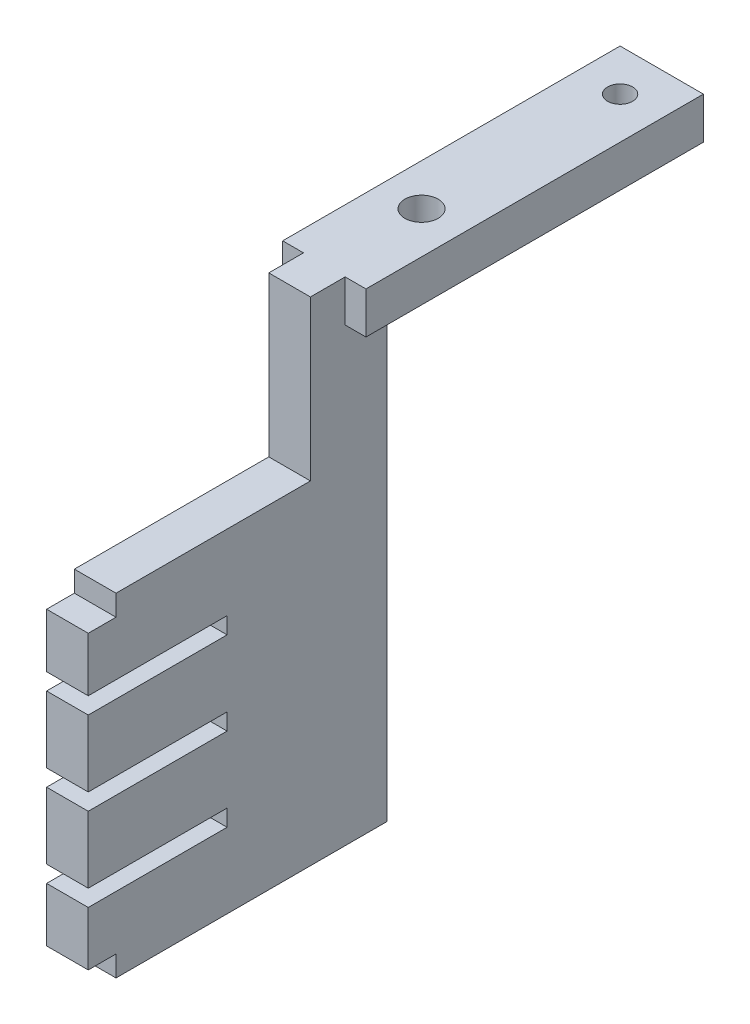
ISO-10303-21;
HEADER;
FILE_DESCRIPTION(('STEP AP214'),'2;1');
FILE_NAME('part.step','',(''),(''),'','','');
FILE_SCHEMA(('AUTOMOTIVE_DESIGN { 1 0 10303 214 1 1 1 1 }'));
ENDSEC;
DATA;
#1=APPLICATION_CONTEXT('core data for automotive mechanical design processes');
#2=APPLICATION_PROTOCOL_DEFINITION('international standard','automotive_design',2000,#1);
#3=PRODUCT_CONTEXT('',#1,'mechanical');
#4=PRODUCT('Part','Part','',(#3));
#5=PRODUCT_RELATED_PRODUCT_CATEGORY('part','',(#4));
#6=PRODUCT_DEFINITION_FORMATION('','',#4);
#7=PRODUCT_DEFINITION_CONTEXT('part definition',#1,'design');
#8=PRODUCT_DEFINITION('design','',#6,#7);
#9=PRODUCT_DEFINITION_SHAPE('','',#8);
#10=(LENGTH_UNIT() NAMED_UNIT(*) SI_UNIT(.MILLI.,.METRE.));
#11=(NAMED_UNIT(*) PLANE_ANGLE_UNIT() SI_UNIT($,.RADIAN.));
#12=(NAMED_UNIT(*) SI_UNIT($,.STERADIAN.) SOLID_ANGLE_UNIT());
#13=UNCERTAINTY_MEASURE_WITH_UNIT(LENGTH_MEASURE(1.E-05),#10,'distance_accuracy_value','');
#14=(GEOMETRIC_REPRESENTATION_CONTEXT(3) GLOBAL_UNCERTAINTY_ASSIGNED_CONTEXT((#13)) GLOBAL_UNIT_ASSIGNED_CONTEXT((#10,
#11,#12)) REPRESENTATION_CONTEXT('',''));
#15=CARTESIAN_POINT('',(0.,0.,0.));
#16=DIRECTION('',(0.,0.,1.));
#17=DIRECTION('',(1.,0.,0.));
#18=AXIS2_PLACEMENT_3D('',#15,#16,#17);
#19=CARTESIAN_POINT('',(16.3,23.475,50.));
#20=DIRECTION('',(1.,0.,0.));
#21=DIRECTION('',(0.,0.,-1.));
#22=AXIS2_PLACEMENT_3D('',#19,#20,#21);
#23=PLANE('',#22);
#24=DIRECTION('',(0.,-1.,0.));
#25=VECTOR('',#24,1.);
#26=CARTESIAN_POINT('',(16.3,23.475,48.));
#27=LINE('',#26,#25);
#28=CARTESIAN_POINT('',(16.3,-10.5,48.));
#29=VERTEX_POINT('',#28);
#30=CARTESIAN_POINT('',(16.3,-12.,48.));
#31=VERTEX_POINT('',#30);
#32=EDGE_CURVE('E53',#29,#31,#27,.T.);
#33=ORIENTED_EDGE('',*,*,#32,.F.);
#34=DIRECTION('',(0.,0.,-1.));
#35=VECTOR('',#34,1.);
#36=CARTESIAN_POINT('',(16.3,-10.5,50.));
#37=LINE('',#36,#35);
#38=CARTESIAN_POINT('',(16.3,-10.5,50.));
#39=VERTEX_POINT('',#38);
#40=EDGE_CURVE('E258',#39,#29,#37,.T.);
#41=ORIENTED_EDGE('',*,*,#40,.F.);
#42=DIRECTION('',(0.,-1.,0.));
#43=VECTOR('',#42,1.);
#44=CARTESIAN_POINT('',(16.3,23.475,50.));
#45=LINE('',#44,#43);
#46=CARTESIAN_POINT('',(16.3,-6.6,50.));
#47=VERTEX_POINT('',#46);
#48=EDGE_CURVE('E328',#47,#39,#45,.T.);
#49=ORIENTED_EDGE('',*,*,#48,.F.);
#50=DIRECTION('',(0.,0.,1.));
#51=VECTOR('',#50,1.);
#52=CARTESIAN_POINT('',(16.3,-6.6,50.));
#53=LINE('',#52,#51);
#54=CARTESIAN_POINT('',(16.3,-6.6,40.));
#55=VERTEX_POINT('',#54);
#56=EDGE_CURVE('E304',#55,#47,#53,.T.);
#57=ORIENTED_EDGE('',*,*,#56,.F.);
#58=DIRECTION('',(0.,-1.,0.));
#59=VECTOR('',#58,1.);
#60=CARTESIAN_POINT('',(16.3,23.475,40.));
#61=LINE('',#60,#59);
#62=CARTESIAN_POINT('',(16.3,-5.4,40.));
#63=VERTEX_POINT('',#62);
#64=EDGE_CURVE('E314',#63,#55,#61,.T.);
#65=ORIENTED_EDGE('',*,*,#64,.F.);
#66=DIRECTION('',(0.,0.,-1.));
#67=VECTOR('',#66,1.);
#68=CARTESIAN_POINT('',(16.3,-5.4,50.));
#69=LINE('',#68,#67);
#70=CARTESIAN_POINT('',(16.3,-5.4,50.));
#71=VERTEX_POINT('',#70);
#72=EDGE_CURVE('E301',#71,#63,#69,.T.);
#73=ORIENTED_EDGE('',*,*,#72,.F.);
#74=CARTESIAN_POINT('',(16.3,-0.6,50.));
#75=VERTEX_POINT('',#74);
#76=EDGE_CURVE('E334',#75,#71,#45,.T.);
#77=ORIENTED_EDGE('',*,*,#76,.F.);
#78=DIRECTION('',(0.,0.,1.));
#79=VECTOR('',#78,1.);
#80=CARTESIAN_POINT('',(16.3,-0.6,50.));
#81=LINE('',#80,#79);
#82=CARTESIAN_POINT('',(16.3,-0.6,40.));
#83=VERTEX_POINT('',#82);
#84=EDGE_CURVE('E300',#83,#75,#81,.T.);
#85=ORIENTED_EDGE('',*,*,#84,.F.);
#86=DIRECTION('',(0.,-1.,0.));
#87=VECTOR('',#86,1.);
#88=CARTESIAN_POINT('',(16.3,23.475,40.));
#89=LINE('',#88,#87);
#90=CARTESIAN_POINT('',(16.3,0.6,40.));
#91=VERTEX_POINT('',#90);
#92=EDGE_CURVE('E312',#91,#83,#89,.T.);
#93=ORIENTED_EDGE('',*,*,#92,.F.);
#94=DIRECTION('',(0.,0.,-1.));
#95=VECTOR('',#94,1.);
#96=CARTESIAN_POINT('',(16.3,0.6,50.));
#97=LINE('',#96,#95);
#98=CARTESIAN_POINT('',(16.3,0.6,50.));
#99=VERTEX_POINT('',#98);
#100=EDGE_CURVE('E291',#99,#91,#97,.T.);
#101=ORIENTED_EDGE('',*,*,#100,.F.);
#102=CARTESIAN_POINT('',(16.3,5.4,50.));
#103=VERTEX_POINT('',#102);
#104=EDGE_CURVE('E337',#103,#99,#45,.T.);
#105=ORIENTED_EDGE('',*,*,#104,.F.);
#106=DIRECTION('',(0.,0.,1.));
#107=VECTOR('',#106,1.);
#108=CARTESIAN_POINT('',(16.3,5.4,50.));
#109=LINE('',#108,#107);
#110=CARTESIAN_POINT('',(16.3,5.4,40.));
#111=VERTEX_POINT('',#110);
#112=EDGE_CURVE('E288',#111,#103,#109,.T.);
#113=ORIENTED_EDGE('',*,*,#112,.F.);
#114=DIRECTION('',(0.,-1.,0.));
#115=VECTOR('',#114,1.);
#116=CARTESIAN_POINT('',(16.3,23.475,40.));
#117=LINE('',#116,#115);
#118=CARTESIAN_POINT('',(16.3,6.6,40.));
#119=VERTEX_POINT('',#118);
#120=EDGE_CURVE('E311',#119,#111,#117,.T.);
#121=ORIENTED_EDGE('',*,*,#120,.F.);
#122=DIRECTION('',(0.,0.,-1.));
#123=VECTOR('',#122,1.);
#124=CARTESIAN_POINT('',(16.3,6.6,50.));
#125=LINE('',#124,#123);
#126=CARTESIAN_POINT('',(16.3,6.6,50.));
#127=VERTEX_POINT('',#126);
#128=EDGE_CURVE('E283',#127,#119,#125,.T.);
#129=ORIENTED_EDGE('',*,*,#128,.F.);
#130=CARTESIAN_POINT('',(16.3,10.5,50.));
#131=VERTEX_POINT('',#130);
#132=EDGE_CURVE('E335',#131,#127,#45,.T.);
#133=ORIENTED_EDGE('',*,*,#132,.F.);
#134=DIRECTION('',(0.,0.,1.));
#135=VECTOR('',#134,1.);
#136=CARTESIAN_POINT('',(16.3,10.5,50.));
#137=LINE('',#136,#135);
#138=CARTESIAN_POINT('',(16.3,10.5,48.));
#139=VERTEX_POINT('',#138);
#140=EDGE_CURVE('E234',#139,#131,#137,.T.);
#141=ORIENTED_EDGE('',*,*,#140,.F.);
#142=DIRECTION('',(0.,-1.,0.));
#143=VECTOR('',#142,1.);
#144=CARTESIAN_POINT('',(16.3,23.475,48.));
#145=LINE('',#144,#143);
#146=CARTESIAN_POINT('',(16.3,12.,48.));
#147=VERTEX_POINT('',#146);
#148=EDGE_CURVE('E238',#147,#139,#145,.T.);
#149=ORIENTED_EDGE('',*,*,#148,.F.);
#150=DIRECTION('',(0.,0.,1.));
#151=VECTOR('',#150,1.);
#152=CARTESIAN_POINT('',(16.3,12.,50.));
#153=LINE('',#152,#151);
#154=CARTESIAN_POINT('',(16.3,12.,34.));
#155=VERTEX_POINT('',#154);
#156=EDGE_CURVE('E277',#155,#147,#153,.T.);
#157=ORIENTED_EDGE('',*,*,#156,.F.);
#158=DIRECTION('',(0.,-1.,0.));
#159=VECTOR('',#158,1.);
#160=CARTESIAN_POINT('',(16.3,23.475,34.));
#161=LINE('',#160,#159);
#162=CARTESIAN_POINT('',(16.3,23.475,34.));
#163=VERTEX_POINT('',#162);
#164=EDGE_CURVE('E307',#163,#155,#161,.T.);
#165=ORIENTED_EDGE('',*,*,#164,.F.);
#166=DIRECTION('',(0.,0.,-1.));
#167=VECTOR('',#166,1.);
#168=CARTESIAN_POINT('',(16.3,23.475,50.));
#169=LINE('',#168,#167);
#170=CARTESIAN_POINT('',(16.3,23.475,31.5));
#171=VERTEX_POINT('',#170);
#172=EDGE_CURVE('E339',#163,#171,#169,.T.);
#173=ORIENTED_EDGE('',*,*,#172,.T.);
#174=DIRECTION('',(0.,1.,0.));
#175=VECTOR('',#174,1.);
#176=CARTESIAN_POINT('',(16.3,0.,31.5));
#177=LINE('',#176,#175);
#178=CARTESIAN_POINT('',(16.3,20.475,31.5));
#179=VERTEX_POINT('',#178);
#180=EDGE_CURVE('E398',#179,#171,#177,.T.);
#181=ORIENTED_EDGE('',*,*,#180,.F.);
#182=DIRECTION('',(0.,0.,-1.));
#183=VECTOR('',#182,1.);
#184=CARTESIAN_POINT('',(16.3,20.475,31.5));
#185=LINE('',#184,#183);
#186=CARTESIAN_POINT('',(16.3,20.475,28.5));
#187=VERTEX_POINT('',#186);
#188=EDGE_CURVE('E356',#179,#187,#185,.T.);
#189=ORIENTED_EDGE('',*,*,#188,.T.);
#190=DIRECTION('',(0.,-1.,0.));
#191=VECTOR('',#190,1.);
#192=CARTESIAN_POINT('',(16.3,23.475,28.5));
#193=LINE('',#192,#191);
#194=CARTESIAN_POINT('',(16.3,-12.,28.5));
#195=VERTEX_POINT('',#194);
#196=EDGE_CURVE('E326',#187,#195,#193,.T.);
#197=ORIENTED_EDGE('',*,*,#196,.T.);
#198=DIRECTION('',(0.,0.,-1.));
#199=VECTOR('',#198,1.);
#200=CARTESIAN_POINT('',(16.3,-12.,50.));
#201=LINE('',#200,#199);
#202=EDGE_CURVE('E353',#31,#195,#201,.T.);
#203=ORIENTED_EDGE('',*,*,#202,.F.);
#204=EDGE_LOOP('',(#33,#41,#49,#57,#65,#73,#77,#85,#93,#101,#105,#113,#121,#129,#133,#141,#149,
#157,#165,#173,#181,#189,#197,#203));
#205=FACE_BOUND('',#204,.T.);
#206=ADVANCED_FACE('F39',(#205),#23,.F.);
#207=CARTESIAN_POINT('',(19.3,-12.,50.));
#208=DIRECTION('',(-1.,0.,0.));
#209=DIRECTION('',(0.,0.,1.));
#210=AXIS2_PLACEMENT_3D('',#207,#208,#209);
#211=PLANE('',#210);
#212=DIRECTION('',(0.,1.,0.));
#213=VECTOR('',#212,1.);
#214=CARTESIAN_POINT('',(19.3,-12.,48.));
#215=LINE('',#214,#213);
#216=CARTESIAN_POINT('',(19.3,-12.,48.));
#217=VERTEX_POINT('',#216);
#218=CARTESIAN_POINT('',(19.3,-10.5,48.));
#219=VERTEX_POINT('',#218);
#220=EDGE_CURVE('E250',#217,#219,#215,.T.);
#221=ORIENTED_EDGE('',*,*,#220,.F.);
#222=DIRECTION('',(0.,0.,-1.));
#223=VECTOR('',#222,1.);
#224=CARTESIAN_POINT('',(19.3,-12.,50.));
#225=LINE('',#224,#223);
#226=CARTESIAN_POINT('',(19.3,-12.,28.5));
#227=VERTEX_POINT('',#226);
#228=EDGE_CURVE('E352',#217,#227,#225,.T.);
#229=ORIENTED_EDGE('',*,*,#228,.T.);
#230=DIRECTION('',(0.,1.,0.));
#231=VECTOR('',#230,1.);
#232=CARTESIAN_POINT('',(19.3,-12.,28.5));
#233=LINE('',#232,#231);
#234=CARTESIAN_POINT('',(19.3,20.475,28.5));
#235=VERTEX_POINT('',#234);
#236=EDGE_CURVE('E333',#227,#235,#233,.T.);
#237=ORIENTED_EDGE('',*,*,#236,.T.);
#238=DIRECTION('',(0.,0.,1.));
#239=VECTOR('',#238,1.);
#240=CARTESIAN_POINT('',(19.3,20.475,31.5));
#241=LINE('',#240,#239);
#242=CARTESIAN_POINT('',(19.3,20.475,31.5));
#243=VERTEX_POINT('',#242);
#244=EDGE_CURVE('E358',#235,#243,#241,.T.);
#245=ORIENTED_EDGE('',*,*,#244,.T.);
#246=DIRECTION('',(0.,-1.,0.));
#247=VECTOR('',#246,1.);
#248=CARTESIAN_POINT('',(19.3,0.,31.5));
#249=LINE('',#248,#247);
#250=CARTESIAN_POINT('',(19.3,23.475,31.5));
#251=VERTEX_POINT('',#250);
#252=EDGE_CURVE('E396',#251,#243,#249,.T.);
#253=ORIENTED_EDGE('',*,*,#252,.F.);
#254=DIRECTION('',(0.,0.,-1.));
#255=VECTOR('',#254,1.);
#256=CARTESIAN_POINT('',(19.3,23.475,50.));
#257=LINE('',#256,#255);
#258=CARTESIAN_POINT('',(19.3,23.475,34.));
#259=VERTEX_POINT('',#258);
#260=EDGE_CURVE('E348',#259,#251,#257,.T.);
#261=ORIENTED_EDGE('',*,*,#260,.F.);
#262=DIRECTION('',(0.,1.,0.));
#263=VECTOR('',#262,1.);
#264=CARTESIAN_POINT('',(19.3,-12.,34.));
#265=LINE('',#264,#263);
#266=CARTESIAN_POINT('',(19.3,12.,34.));
#267=VERTEX_POINT('',#266);
#268=EDGE_CURVE('E420',#267,#259,#265,.T.);
#269=ORIENTED_EDGE('',*,*,#268,.F.);
#270=DIRECTION('',(0.,0.,-1.));
#271=VECTOR('',#270,1.);
#272=CARTESIAN_POINT('',(19.3,12.,50.));
#273=LINE('',#272,#271);
#274=CARTESIAN_POINT('',(19.3,12.,48.));
#275=VERTEX_POINT('',#274);
#276=EDGE_CURVE('E244',#275,#267,#273,.T.);
#277=ORIENTED_EDGE('',*,*,#276,.F.);
#278=DIRECTION('',(0.,1.,0.));
#279=VECTOR('',#278,1.);
#280=CARTESIAN_POINT('',(19.3,-12.,48.));
#281=LINE('',#280,#279);
#282=CARTESIAN_POINT('',(19.3,10.5,48.));
#283=VERTEX_POINT('',#282);
#284=EDGE_CURVE('E65',#283,#275,#281,.T.);
#285=ORIENTED_EDGE('',*,*,#284,.F.);
#286=DIRECTION('',(0.,0.,-1.));
#287=VECTOR('',#286,1.);
#288=CARTESIAN_POINT('',(19.3,10.5,50.));
#289=LINE('',#288,#287);
#290=CARTESIAN_POINT('',(19.3,10.5,50.));
#291=VERTEX_POINT('',#290);
#292=EDGE_CURVE('E228',#291,#283,#289,.T.);
#293=ORIENTED_EDGE('',*,*,#292,.F.);
#294=DIRECTION('',(0.,1.,0.));
#295=VECTOR('',#294,1.);
#296=CARTESIAN_POINT('',(19.3,-12.,50.));
#297=LINE('',#296,#295);
#298=CARTESIAN_POINT('',(19.3,6.6,50.));
#299=VERTEX_POINT('',#298);
#300=EDGE_CURVE('E343',#299,#291,#297,.T.);
#301=ORIENTED_EDGE('',*,*,#300,.F.);
#302=DIRECTION('',(0.,0.,1.));
#303=VECTOR('',#302,1.);
#304=CARTESIAN_POINT('',(19.3,6.6,50.));
#305=LINE('',#304,#303);
#306=CARTESIAN_POINT('',(19.3,6.6,40.));
#307=VERTEX_POINT('',#306);
#308=EDGE_CURVE('E284',#307,#299,#305,.T.);
#309=ORIENTED_EDGE('',*,*,#308,.F.);
#310=DIRECTION('',(0.,1.,0.));
#311=VECTOR('',#310,1.);
#312=CARTESIAN_POINT('',(19.3,-12.,40.));
#313=LINE('',#312,#311);
#314=CARTESIAN_POINT('',(19.3,5.4,40.));
#315=VERTEX_POINT('',#314);
#316=EDGE_CURVE('E422',#315,#307,#313,.T.);
#317=ORIENTED_EDGE('',*,*,#316,.F.);
#318=DIRECTION('',(0.,0.,-1.));
#319=VECTOR('',#318,1.);
#320=CARTESIAN_POINT('',(19.3,5.4,50.));
#321=LINE('',#320,#319);
#322=CARTESIAN_POINT('',(19.3,5.4,50.));
#323=VERTEX_POINT('',#322);
#324=EDGE_CURVE('E287',#323,#315,#321,.T.);
#325=ORIENTED_EDGE('',*,*,#324,.F.);
#326=CARTESIAN_POINT('',(19.3,0.6,50.));
#327=VERTEX_POINT('',#326);
#328=EDGE_CURVE('E438',#327,#323,#297,.T.);
#329=ORIENTED_EDGE('',*,*,#328,.F.);
#330=DIRECTION('',(0.,0.,1.));
#331=VECTOR('',#330,1.);
#332=CARTESIAN_POINT('',(19.3,0.6,50.));
#333=LINE('',#332,#331);
#334=CARTESIAN_POINT('',(19.3,0.6,40.));
#335=VERTEX_POINT('',#334);
#336=EDGE_CURVE('E293',#335,#327,#333,.T.);
#337=ORIENTED_EDGE('',*,*,#336,.F.);
#338=DIRECTION('',(0.,1.,0.));
#339=VECTOR('',#338,1.);
#340=CARTESIAN_POINT('',(19.3,-12.,40.));
#341=LINE('',#340,#339);
#342=CARTESIAN_POINT('',(19.3,-0.6,40.));
#343=VERTEX_POINT('',#342);
#344=EDGE_CURVE('E425',#343,#335,#341,.T.);
#345=ORIENTED_EDGE('',*,*,#344,.F.);
#346=DIRECTION('',(0.,0.,-1.));
#347=VECTOR('',#346,1.);
#348=CARTESIAN_POINT('',(19.3,-0.6,50.));
#349=LINE('',#348,#347);
#350=CARTESIAN_POINT('',(19.3,-0.6,50.));
#351=VERTEX_POINT('',#350);
#352=EDGE_CURVE('E294',#351,#343,#349,.T.);
#353=ORIENTED_EDGE('',*,*,#352,.F.);
#354=CARTESIAN_POINT('',(19.3,-5.4,50.));
#355=VERTEX_POINT('',#354);
#356=EDGE_CURVE('E338',#355,#351,#297,.T.);
#357=ORIENTED_EDGE('',*,*,#356,.F.);
#358=DIRECTION('',(0.,0.,1.));
#359=VECTOR('',#358,1.);
#360=CARTESIAN_POINT('',(19.3,-5.4,50.));
#361=LINE('',#360,#359);
#362=CARTESIAN_POINT('',(19.3,-5.4,40.));
#363=VERTEX_POINT('',#362);
#364=EDGE_CURVE('E299',#363,#355,#361,.T.);
#365=ORIENTED_EDGE('',*,*,#364,.F.);
#366=DIRECTION('',(0.,1.,0.));
#367=VECTOR('',#366,1.);
#368=CARTESIAN_POINT('',(19.3,-12.,40.));
#369=LINE('',#368,#367);
#370=CARTESIAN_POINT('',(19.3,-6.6,40.));
#371=VERTEX_POINT('',#370);
#372=EDGE_CURVE('E428',#371,#363,#369,.T.);
#373=ORIENTED_EDGE('',*,*,#372,.F.);
#374=DIRECTION('',(0.,0.,-1.));
#375=VECTOR('',#374,1.);
#376=CARTESIAN_POINT('',(19.3,-6.6,50.));
#377=LINE('',#376,#375);
#378=CARTESIAN_POINT('',(19.3,-6.6,50.));
#379=VERTEX_POINT('',#378);
#380=EDGE_CURVE('E303',#379,#371,#377,.T.);
#381=ORIENTED_EDGE('',*,*,#380,.F.);
#382=CARTESIAN_POINT('',(19.3,-10.5,50.));
#383=VERTEX_POINT('',#382);
#384=EDGE_CURVE('E340',#383,#379,#297,.T.);
#385=ORIENTED_EDGE('',*,*,#384,.F.);
#386=DIRECTION('',(0.,0.,1.));
#387=VECTOR('',#386,1.);
#388=CARTESIAN_POINT('',(19.3,-10.5,50.));
#389=LINE('',#388,#387);
#390=EDGE_CURVE('E251',#219,#383,#389,.T.);
#391=ORIENTED_EDGE('',*,*,#390,.F.);
#392=EDGE_LOOP('',(#221,#229,#237,#245,#253,#261,#269,#277,#285,#293,#301,#309,#317,#325,#329,
#337,#345,#353,#357,#365,#373,#381,#385,#391));
#393=FACE_BOUND('',#392,.T.);
#394=ADVANCED_FACE('F243',(#393),#211,.F.);
#395=CARTESIAN_POINT('',(0.,0.,50.));
#396=DIRECTION('',(0.,0.,1.));
#397=DIRECTION('',(1.,0.,0.));
#398=AXIS2_PLACEMENT_3D('',#395,#396,#397);
#399=PLANE('',#398);
#400=ORIENTED_EDGE('',*,*,#48,.T.);
#401=DIRECTION('',(1.,0.,0.));
#402=VECTOR('',#401,1.);
#403=CARTESIAN_POINT('',(0.,-10.5,50.));
#404=LINE('',#403,#402);
#405=EDGE_CURVE('E11',#39,#383,#404,.T.);
#406=ORIENTED_EDGE('',*,*,#405,.T.);
#407=ORIENTED_EDGE('',*,*,#384,.T.);
#408=DIRECTION('',(-1.,0.,0.));
#409=VECTOR('',#408,1.);
#410=CARTESIAN_POINT('',(0.,-6.6,50.));
#411=LINE('',#410,#409);
#412=EDGE_CURVE('E417',#379,#47,#411,.T.);
#413=ORIENTED_EDGE('',*,*,#412,.T.);
#414=EDGE_LOOP('',(#400,#406,#407,#413));
#415=FACE_BOUND('',#414,.T.);
#416=ADVANCED_FACE('F502',(#415),#399,.T.);
#417=ORIENTED_EDGE('',*,*,#300,.T.);
#418=DIRECTION('',(-1.,0.,0.));
#419=VECTOR('',#418,1.);
#420=CARTESIAN_POINT('',(0.,10.5,50.));
#421=LINE('',#420,#419);
#422=EDGE_CURVE('E50',#291,#131,#421,.T.);
#423=ORIENTED_EDGE('',*,*,#422,.T.);
#424=ORIENTED_EDGE('',*,*,#132,.T.);
#425=DIRECTION('',(1.,0.,0.));
#426=VECTOR('',#425,1.);
#427=CARTESIAN_POINT('',(0.,6.6,50.));
#428=LINE('',#427,#426);
#429=EDGE_CURVE('E405',#127,#299,#428,.T.);
#430=ORIENTED_EDGE('',*,*,#429,.T.);
#431=EDGE_LOOP('',(#417,#423,#424,#430));
#432=FACE_BOUND('',#431,.T.);
#433=ADVANCED_FACE('F433',(#432),#399,.T.);
#434=CARTESIAN_POINT('',(16.3,-12.,50.));
#435=DIRECTION('',(0.,1.,0.));
#436=DIRECTION('',(0.,0.,1.));
#437=AXIS2_PLACEMENT_3D('',#434,#435,#436);
#438=PLANE('',#437);
#439=DIRECTION('',(1.,0.,0.));
#440=VECTOR('',#439,1.);
#441=CARTESIAN_POINT('',(16.3,-12.,48.));
#442=LINE('',#441,#440);
#443=EDGE_CURVE('E427',#31,#217,#442,.T.);
#444=ORIENTED_EDGE('',*,*,#443,.F.);
#445=ORIENTED_EDGE('',*,*,#202,.T.);
#446=DIRECTION('',(1.,0.,0.));
#447=VECTOR('',#446,1.);
#448=CARTESIAN_POINT('',(16.3,-12.,28.5));
#449=LINE('',#448,#447);
#450=EDGE_CURVE('E344',#195,#227,#449,.T.);
#451=ORIENTED_EDGE('',*,*,#450,.T.);
#452=ORIENTED_EDGE('',*,*,#228,.F.);
#453=EDGE_LOOP('',(#444,#445,#451,#452));
#454=FACE_BOUND('',#453,.T.);
#455=ADVANCED_FACE('F507',(#454),#438,.F.);
#456=CARTESIAN_POINT('',(14.8,12.,51.));
#457=DIRECTION('',(0.,1.,0.));
#458=DIRECTION('',(0.,0.,1.));
#459=AXIS2_PLACEMENT_3D('',#456,#457,#458);
#460=PLANE('',#459);
#461=ORIENTED_EDGE('',*,*,#156,.T.);
#462=DIRECTION('',(1.,0.,0.));
#463=VECTOR('',#462,1.);
#464=CARTESIAN_POINT('',(14.8,12.,48.));
#465=LINE('',#464,#463);
#466=EDGE_CURVE('E426',#147,#275,#465,.T.);
#467=ORIENTED_EDGE('',*,*,#466,.T.);
#468=ORIENTED_EDGE('',*,*,#276,.T.);
#469=DIRECTION('',(-1.,0.,0.));
#470=VECTOR('',#469,1.);
#471=CARTESIAN_POINT('',(14.8,12.,34.));
#472=LINE('',#471,#470);
#473=EDGE_CURVE('E256',#267,#155,#472,.T.);
#474=ORIENTED_EDGE('',*,*,#473,.T.);
#475=EDGE_LOOP('',(#461,#467,#468,#474));
#476=FACE_BOUND('',#475,.T.);
#477=ADVANCED_FACE('F521',(#476),#460,.T.);
#478=CARTESIAN_POINT('',(20.8,23.475,31.5));
#479=DIRECTION('',(0.,-1.,0.));
#480=DIRECTION('',(0.,0.,-1.));
#481=AXIS2_PLACEMENT_3D('',#478,#479,#480);
#482=PLANE('',#481);
#483=CARTESIAN_POINT('',(17.8,23.475,10.2));
#484=DIRECTION('',(0.,1.,0.));
#485=DIRECTION('',(0.,0.,1.));
#486=AXIS2_PLACEMENT_3D('',#483,#484,#485);
#487=CIRCLE('',#486,0.900000000000001);
#488=CARTESIAN_POINT('',(17.8,23.475,11.1));
#489=VERTEX_POINT('',#488);
#490=EDGE_CURVE('E320',#489,#489,#487,.T.);
#491=ORIENTED_EDGE('',*,*,#490,.F.);
#492=EDGE_LOOP('',(#491));
#493=FACE_BOUND('',#492,.T.);
#494=CARTESIAN_POINT('',(17.8,23.475,24.5));
#495=DIRECTION('',(0.,1.,0.));
#496=DIRECTION('',(0.,0.,1.));
#497=AXIS2_PLACEMENT_3D('',#494,#495,#496);
#498=CIRCLE('',#497,1.2);
#499=CARTESIAN_POINT('',(17.8,23.475,25.7));
#500=VERTEX_POINT('',#499);
#501=EDGE_CURVE('E319',#500,#500,#498,.T.);
#502=ORIENTED_EDGE('',*,*,#501,.F.);
#503=EDGE_LOOP('',(#502));
#504=FACE_BOUND('',#503,.T.);
#505=DIRECTION('',(-1.,0.,0.));
#506=VECTOR('',#505,1.);
#507=CARTESIAN_POINT('',(20.8,23.475,34.));
#508=LINE('',#507,#506);
#509=EDGE_CURVE('E310',#259,#163,#508,.T.);
#510=ORIENTED_EDGE('',*,*,#509,.F.);
#511=ORIENTED_EDGE('',*,*,#260,.T.);
#512=DIRECTION('',(-1.,0.,0.));
#513=VECTOR('',#512,1.);
#514=CARTESIAN_POINT('',(20.8,23.475,31.5));
#515=LINE('',#514,#513);
#516=CARTESIAN_POINT('',(20.8,23.475,31.5));
#517=VERTEX_POINT('',#516);
#518=EDGE_CURVE('E372',#517,#251,#515,.T.);
#519=ORIENTED_EDGE('',*,*,#518,.F.);
#520=DIRECTION('',(0.,0.,-1.));
#521=VECTOR('',#520,1.);
#522=CARTESIAN_POINT('',(20.8,23.475,31.5));
#523=LINE('',#522,#521);
#524=CARTESIAN_POINT('',(20.8,23.475,7.2));
#525=VERTEX_POINT('',#524);
#526=EDGE_CURVE('E390',#517,#525,#523,.T.);
#527=ORIENTED_EDGE('',*,*,#526,.T.);
#528=DIRECTION('',(-1.,0.,0.));
#529=VECTOR('',#528,1.);
#530=CARTESIAN_POINT('',(20.8,23.475,7.2));
#531=LINE('',#530,#529);
#532=CARTESIAN_POINT('',(14.8,23.475,7.2));
#533=VERTEX_POINT('',#532);
#534=EDGE_CURVE('E370',#525,#533,#531,.T.);
#535=ORIENTED_EDGE('',*,*,#534,.T.);
#536=DIRECTION('',(0.,0.,-1.));
#537=VECTOR('',#536,1.);
#538=CARTESIAN_POINT('',(14.8,23.475,31.5));
#539=LINE('',#538,#537);
#540=CARTESIAN_POINT('',(14.8,23.475,31.5));
#541=VERTEX_POINT('',#540);
#542=EDGE_CURVE('E380',#541,#533,#539,.T.);
#543=ORIENTED_EDGE('',*,*,#542,.F.);
#544=EDGE_CURVE('E373',#171,#541,#515,.T.);
#545=ORIENTED_EDGE('',*,*,#544,.F.);
#546=ORIENTED_EDGE('',*,*,#172,.F.);
#547=EDGE_LOOP('',(#510,#511,#519,#527,#535,#543,#545,#546));
#548=FACE_BOUND('',#547,.T.);
#549=ADVANCED_FACE('F522',(#493,#504,#548),#482,.F.);
#550=ORIENTED_EDGE('',*,*,#76,.T.);
#551=DIRECTION('',(1.,0.,0.));
#552=VECTOR('',#551,1.);
#553=CARTESIAN_POINT('',(0.,-5.4,50.));
#554=LINE('',#553,#552);
#555=EDGE_CURVE('E411',#71,#355,#554,.T.);
#556=ORIENTED_EDGE('',*,*,#555,.T.);
#557=ORIENTED_EDGE('',*,*,#356,.T.);
#558=DIRECTION('',(-1.,0.,0.));
#559=VECTOR('',#558,1.);
#560=CARTESIAN_POINT('',(0.,-0.6,50.));
#561=LINE('',#560,#559);
#562=EDGE_CURVE('E412',#351,#75,#561,.T.);
#563=ORIENTED_EDGE('',*,*,#562,.T.);
#564=EDGE_LOOP('',(#550,#556,#557,#563));
#565=FACE_BOUND('',#564,.T.);
#566=ADVANCED_FACE('F442',(#565),#399,.T.);
#567=ORIENTED_EDGE('',*,*,#104,.T.);
#568=DIRECTION('',(1.,0.,0.));
#569=VECTOR('',#568,1.);
#570=CARTESIAN_POINT('',(0.,0.6,50.));
#571=LINE('',#570,#569);
#572=EDGE_CURVE('E406',#99,#327,#571,.T.);
#573=ORIENTED_EDGE('',*,*,#572,.T.);
#574=ORIENTED_EDGE('',*,*,#328,.T.);
#575=DIRECTION('',(-1.,0.,0.));
#576=VECTOR('',#575,1.);
#577=CARTESIAN_POINT('',(0.,5.4,50.));
#578=LINE('',#577,#576);
#579=EDGE_CURVE('E403',#323,#103,#578,.T.);
#580=ORIENTED_EDGE('',*,*,#579,.T.);
#581=EDGE_LOOP('',(#567,#573,#574,#580));
#582=FACE_BOUND('',#581,.T.);
#583=ADVANCED_FACE('F467',(#582),#399,.T.);
#584=CARTESIAN_POINT('',(14.8,20.475,31.5));
#585=DIRECTION('',(0.,1.,0.));
#586=DIRECTION('',(0.,0.,1.));
#587=AXIS2_PLACEMENT_3D('',#584,#585,#586);
#588=PLANE('',#587);
#589=CARTESIAN_POINT('',(17.8,20.475,24.5));
#590=DIRECTION('',(0.,1.,0.));
#591=DIRECTION('',(0.,0.,1.));
#592=AXIS2_PLACEMENT_3D('',#589,#590,#591);
#593=CIRCLE('',#592,1.2);
#594=CARTESIAN_POINT('',(17.8,20.475,25.7));
#595=VERTEX_POINT('',#594);
#596=EDGE_CURVE('E327',#595,#595,#593,.T.);
#597=ORIENTED_EDGE('',*,*,#596,.T.);
#598=EDGE_LOOP('',(#597));
#599=FACE_BOUND('',#598,.T.);
#600=CARTESIAN_POINT('',(17.8,20.475,10.2));
#601=DIRECTION('',(0.,1.,0.));
#602=DIRECTION('',(0.,0.,1.));
#603=AXIS2_PLACEMENT_3D('',#600,#601,#602);
#604=CIRCLE('',#603,0.900000000000001);
#605=CARTESIAN_POINT('',(17.8,20.475,11.1));
#606=VERTEX_POINT('',#605);
#607=EDGE_CURVE('E323',#606,#606,#604,.T.);
#608=ORIENTED_EDGE('',*,*,#607,.T.);
#609=EDGE_LOOP('',(#608));
#610=FACE_BOUND('',#609,.T.);
#611=ORIENTED_EDGE('',*,*,#188,.F.);
#612=DIRECTION('',(1.,0.,0.));
#613=VECTOR('',#612,1.);
#614=CARTESIAN_POINT('',(14.8,20.475,31.5));
#615=LINE('',#614,#613);
#616=CARTESIAN_POINT('',(14.8,20.475,31.5));
#617=VERTEX_POINT('',#616);
#618=EDGE_CURVE('E368',#617,#179,#615,.T.);
#619=ORIENTED_EDGE('',*,*,#618,.F.);
#620=DIRECTION('',(0.,0.,-1.));
#621=VECTOR('',#620,1.);
#622=CARTESIAN_POINT('',(14.8,20.475,31.5));
#623=LINE('',#622,#621);
#624=CARTESIAN_POINT('',(14.8,20.475,7.2));
#625=VERTEX_POINT('',#624);
#626=EDGE_CURVE('E394',#617,#625,#623,.T.);
#627=ORIENTED_EDGE('',*,*,#626,.T.);
#628=DIRECTION('',(1.,0.,0.));
#629=VECTOR('',#628,1.);
#630=CARTESIAN_POINT('',(14.8,20.475,7.2));
#631=LINE('',#630,#629);
#632=CARTESIAN_POINT('',(20.8,20.475,7.2));
#633=VERTEX_POINT('',#632);
#634=EDGE_CURVE('E379',#625,#633,#631,.T.);
#635=ORIENTED_EDGE('',*,*,#634,.T.);
#636=DIRECTION('',(0.,0.,-1.));
#637=VECTOR('',#636,1.);
#638=CARTESIAN_POINT('',(20.8,20.475,31.5));
#639=LINE('',#638,#637);
#640=CARTESIAN_POINT('',(20.8,20.475,31.5));
#641=VERTEX_POINT('',#640);
#642=EDGE_CURVE('E387',#641,#633,#639,.T.);
#643=ORIENTED_EDGE('',*,*,#642,.F.);
#644=EDGE_CURVE('E366',#243,#641,#615,.T.);
#645=ORIENTED_EDGE('',*,*,#644,.F.);
#646=ORIENTED_EDGE('',*,*,#244,.F.);
#647=DIRECTION('',(1.,0.,0.));
#648=VECTOR('',#647,1.);
#649=CARTESIAN_POINT('',(14.8,20.475,28.5));
#650=LINE('',#649,#648);
#651=EDGE_CURVE('E359',#187,#235,#650,.T.);
#652=ORIENTED_EDGE('',*,*,#651,.F.);
#653=EDGE_LOOP('',(#611,#619,#627,#635,#643,#645,#646,#652));
#654=FACE_BOUND('',#653,.T.);
#655=ADVANCED_FACE('F514',(#599,#610,#654),#588,.F.);
#656=CARTESIAN_POINT('',(0.,0.,31.5));
#657=DIRECTION('',(0.,0.,1.));
#658=DIRECTION('',(1.,0.,0.));
#659=AXIS2_PLACEMENT_3D('',#656,#657,#658);
#660=PLANE('',#659);
#661=ORIENTED_EDGE('',*,*,#618,.T.);
#662=ORIENTED_EDGE('',*,*,#180,.T.);
#663=ORIENTED_EDGE('',*,*,#544,.T.);
#664=DIRECTION('',(0.,-1.,0.));
#665=VECTOR('',#664,1.);
#666=CARTESIAN_POINT('',(14.8,23.475,31.5));
#667=LINE('',#666,#665);
#668=EDGE_CURVE('E361',#541,#617,#667,.T.);
#669=ORIENTED_EDGE('',*,*,#668,.T.);
#670=EDGE_LOOP('',(#661,#662,#663,#669));
#671=FACE_BOUND('',#670,.T.);
#672=ADVANCED_FACE('F508',(#671),#660,.T.);
#673=ORIENTED_EDGE('',*,*,#518,.T.);
#674=ORIENTED_EDGE('',*,*,#252,.T.);
#675=ORIENTED_EDGE('',*,*,#644,.T.);
#676=DIRECTION('',(0.,1.,0.));
#677=VECTOR('',#676,1.);
#678=CARTESIAN_POINT('',(20.8,20.475,31.5));
#679=LINE('',#678,#677);
#680=EDGE_CURVE('E371',#641,#517,#679,.T.);
#681=ORIENTED_EDGE('',*,*,#680,.T.);
#682=EDGE_LOOP('',(#673,#674,#675,#681));
#683=FACE_BOUND('',#682,.T.);
#684=ADVANCED_FACE('F515',(#683),#660,.T.);
#685=CARTESIAN_POINT('',(14.8,23.475,31.5));
#686=DIRECTION('',(1.,0.,0.));
#687=DIRECTION('',(0.,0.,-1.));
#688=AXIS2_PLACEMENT_3D('',#685,#686,#687);
#689=PLANE('',#688);
#690=DIRECTION('',(0.,-1.,0.));
#691=VECTOR('',#690,1.);
#692=CARTESIAN_POINT('',(14.8,23.475,7.2));
#693=LINE('',#692,#691);
#694=EDGE_CURVE('E365',#533,#625,#693,.T.);
#695=ORIENTED_EDGE('',*,*,#694,.T.);
#696=ORIENTED_EDGE('',*,*,#626,.F.);
#697=ORIENTED_EDGE('',*,*,#668,.F.);
#698=ORIENTED_EDGE('',*,*,#542,.T.);
#699=EDGE_LOOP('',(#695,#696,#697,#698));
#700=FACE_BOUND('',#699,.T.);
#701=ADVANCED_FACE('F41',(#700),#689,.F.);
#702=CARTESIAN_POINT('',(20.8,20.475,31.5));
#703=DIRECTION('',(-1.,0.,0.));
#704=DIRECTION('',(0.,0.,1.));
#705=AXIS2_PLACEMENT_3D('',#702,#703,#704);
#706=PLANE('',#705);
#707=DIRECTION('',(0.,1.,0.));
#708=VECTOR('',#707,1.);
#709=CARTESIAN_POINT('',(20.8,20.475,7.2));
#710=LINE('',#709,#708);
#711=EDGE_CURVE('E385',#633,#525,#710,.T.);
#712=ORIENTED_EDGE('',*,*,#711,.T.);
#713=ORIENTED_EDGE('',*,*,#526,.F.);
#714=ORIENTED_EDGE('',*,*,#680,.F.);
#715=ORIENTED_EDGE('',*,*,#642,.T.);
#716=EDGE_LOOP('',(#712,#713,#714,#715));
#717=FACE_BOUND('',#716,.T.);
#718=ADVANCED_FACE('F519',(#717),#706,.F.);
#719=CARTESIAN_POINT('',(0.,0.,7.2));
#720=DIRECTION('',(0.,0.,1.));
#721=DIRECTION('',(1.,0.,0.));
#722=AXIS2_PLACEMENT_3D('',#719,#720,#721);
#723=PLANE('',#722);
#724=ORIENTED_EDGE('',*,*,#694,.F.);
#725=ORIENTED_EDGE('',*,*,#534,.F.);
#726=ORIENTED_EDGE('',*,*,#711,.F.);
#727=ORIENTED_EDGE('',*,*,#634,.F.);
#728=EDGE_LOOP('',(#724,#725,#726,#727));
#729=FACE_BOUND('',#728,.T.);
#730=ADVANCED_FACE('F513',(#729),#723,.F.);
#731=CARTESIAN_POINT('',(0.,0.,28.5));
#732=DIRECTION('',(0.,0.,1.));
#733=DIRECTION('',(1.,0.,0.));
#734=AXIS2_PLACEMENT_3D('',#731,#732,#733);
#735=PLANE('',#734);
#736=ORIENTED_EDGE('',*,*,#196,.F.);
#737=ORIENTED_EDGE('',*,*,#651,.T.);
#738=ORIENTED_EDGE('',*,*,#236,.F.);
#739=ORIENTED_EDGE('',*,*,#450,.F.);
#740=EDGE_LOOP('',(#736,#737,#738,#739));
#741=FACE_BOUND('',#740,.T.);
#742=ADVANCED_FACE('F516',(#741),#735,.F.);
#743=CARTESIAN_POINT('',(17.8,-12.,10.2));
#744=DIRECTION('',(0.,1.,0.));
#745=DIRECTION('',(0.,0.,1.));
#746=AXIS2_PLACEMENT_3D('',#743,#744,#745);
#747=CYLINDRICAL_SURFACE('',#746,0.900000000000001);
#748=ORIENTED_EDGE('',*,*,#490,.T.);
#749=EDGE_LOOP('',(#748));
#750=FACE_BOUND('',#749,.T.);
#751=ORIENTED_EDGE('',*,*,#607,.F.);
#752=EDGE_LOOP('',(#751));
#753=FACE_BOUND('',#752,.T.);
#754=ADVANCED_FACE('F736',(#750,#753),#747,.F.);
#755=CARTESIAN_POINT('',(17.8,-12.,24.5));
#756=DIRECTION('',(0.,1.,0.));
#757=DIRECTION('',(0.,0.,1.));
#758=AXIS2_PLACEMENT_3D('',#755,#756,#757);
#759=CYLINDRICAL_SURFACE('',#758,1.2);
#760=ORIENTED_EDGE('',*,*,#501,.T.);
#761=EDGE_LOOP('',(#760));
#762=FACE_BOUND('',#761,.T.);
#763=ORIENTED_EDGE('',*,*,#596,.F.);
#764=EDGE_LOOP('',(#763));
#765=FACE_BOUND('',#764,.T.);
#766=ADVANCED_FACE('F713',(#762,#765),#759,.F.);
#767=CARTESIAN_POINT('',(14.8,12.,34.));
#768=DIRECTION('',(0.,0.,1.));
#769=DIRECTION('',(1.,0.,0.));
#770=AXIS2_PLACEMENT_3D('',#767,#768,#769);
#771=PLANE('',#770);
#772=ORIENTED_EDGE('',*,*,#164,.T.);
#773=ORIENTED_EDGE('',*,*,#473,.F.);
#774=ORIENTED_EDGE('',*,*,#268,.T.);
#775=ORIENTED_EDGE('',*,*,#509,.T.);
#776=EDGE_LOOP('',(#772,#773,#774,#775));
#777=FACE_BOUND('',#776,.T.);
#778=ADVANCED_FACE('F702',(#777),#771,.T.);
#779=CARTESIAN_POINT('',(14.8,5.4,40.));
#780=DIRECTION('',(0.,0.,1.));
#781=DIRECTION('',(1.,0.,0.));
#782=AXIS2_PLACEMENT_3D('',#779,#780,#781);
#783=PLANE('',#782);
#784=ORIENTED_EDGE('',*,*,#120,.T.);
#785=DIRECTION('',(-1.,0.,0.));
#786=VECTOR('',#785,1.);
#787=CARTESIAN_POINT('',(14.8,5.4,40.));
#788=LINE('',#787,#786);
#789=EDGE_CURVE('E275',#315,#111,#788,.T.);
#790=ORIENTED_EDGE('',*,*,#789,.F.);
#791=ORIENTED_EDGE('',*,*,#316,.T.);
#792=DIRECTION('',(-1.,0.,0.));
#793=VECTOR('',#792,1.);
#794=CARTESIAN_POINT('',(14.8,6.6,40.));
#795=LINE('',#794,#793);
#796=EDGE_CURVE('E268',#307,#119,#795,.T.);
#797=ORIENTED_EDGE('',*,*,#796,.T.);
#798=EDGE_LOOP('',(#784,#790,#791,#797));
#799=FACE_BOUND('',#798,.T.);
#800=ADVANCED_FACE('F480',(#799),#783,.T.);
#801=CARTESIAN_POINT('',(14.8,5.4,51.));
#802=DIRECTION('',(0.,1.,0.));
#803=DIRECTION('',(0.,0.,1.));
#804=AXIS2_PLACEMENT_3D('',#801,#802,#803);
#805=PLANE('',#804);
#806=ORIENTED_EDGE('',*,*,#112,.T.);
#807=ORIENTED_EDGE('',*,*,#579,.F.);
#808=ORIENTED_EDGE('',*,*,#324,.T.);
#809=ORIENTED_EDGE('',*,*,#789,.T.);
#810=EDGE_LOOP('',(#806,#807,#808,#809));
#811=FACE_BOUND('',#810,.T.);
#812=ADVANCED_FACE('F474',(#811),#805,.T.);
#813=CARTESIAN_POINT('',(14.8,6.6,40.));
#814=DIRECTION('',(0.,-1.,0.));
#815=DIRECTION('',(0.,0.,-1.));
#816=AXIS2_PLACEMENT_3D('',#813,#814,#815);
#817=PLANE('',#816);
#818=ORIENTED_EDGE('',*,*,#128,.T.);
#819=ORIENTED_EDGE('',*,*,#796,.F.);
#820=ORIENTED_EDGE('',*,*,#308,.T.);
#821=ORIENTED_EDGE('',*,*,#429,.F.);
#822=EDGE_LOOP('',(#818,#819,#820,#821));
#823=FACE_BOUND('',#822,.T.);
#824=ADVANCED_FACE('F492',(#823),#817,.T.);
#825=CARTESIAN_POINT('',(14.8,-0.6,40.));
#826=DIRECTION('',(0.,0.,1.));
#827=DIRECTION('',(1.,0.,0.));
#828=AXIS2_PLACEMENT_3D('',#825,#826,#827);
#829=PLANE('',#828);
#830=ORIENTED_EDGE('',*,*,#92,.T.);
#831=DIRECTION('',(-1.,0.,0.));
#832=VECTOR('',#831,1.);
#833=CARTESIAN_POINT('',(14.8,-0.6,40.));
#834=LINE('',#833,#832);
#835=EDGE_CURVE('E266',#343,#83,#834,.T.);
#836=ORIENTED_EDGE('',*,*,#835,.F.);
#837=ORIENTED_EDGE('',*,*,#344,.T.);
#838=DIRECTION('',(-1.,0.,0.));
#839=VECTOR('',#838,1.);
#840=CARTESIAN_POINT('',(14.8,0.6,40.));
#841=LINE('',#840,#839);
#842=EDGE_CURVE('E264',#335,#91,#841,.T.);
#843=ORIENTED_EDGE('',*,*,#842,.T.);
#844=EDGE_LOOP('',(#830,#836,#837,#843));
#845=FACE_BOUND('',#844,.T.);
#846=ADVANCED_FACE('F483',(#845),#829,.T.);
#847=CARTESIAN_POINT('',(14.8,-0.6,51.));
#848=DIRECTION('',(0.,1.,0.));
#849=DIRECTION('',(0.,0.,1.));
#850=AXIS2_PLACEMENT_3D('',#847,#848,#849);
#851=PLANE('',#850);
#852=ORIENTED_EDGE('',*,*,#84,.T.);
#853=ORIENTED_EDGE('',*,*,#562,.F.);
#854=ORIENTED_EDGE('',*,*,#352,.T.);
#855=ORIENTED_EDGE('',*,*,#835,.T.);
#856=EDGE_LOOP('',(#852,#853,#854,#855));
#857=FACE_BOUND('',#856,.T.);
#858=ADVANCED_FACE('F487',(#857),#851,.T.);
#859=CARTESIAN_POINT('',(14.8,0.6,40.));
#860=DIRECTION('',(0.,-1.,0.));
#861=DIRECTION('',(0.,0.,-1.));
#862=AXIS2_PLACEMENT_3D('',#859,#860,#861);
#863=PLANE('',#862);
#864=ORIENTED_EDGE('',*,*,#100,.T.);
#865=ORIENTED_EDGE('',*,*,#842,.F.);
#866=ORIENTED_EDGE('',*,*,#336,.T.);
#867=ORIENTED_EDGE('',*,*,#572,.F.);
#868=EDGE_LOOP('',(#864,#865,#866,#867));
#869=FACE_BOUND('',#868,.T.);
#870=ADVANCED_FACE('F482',(#869),#863,.T.);
#871=CARTESIAN_POINT('',(14.8,-6.6,40.));
#872=DIRECTION('',(0.,0.,1.));
#873=DIRECTION('',(1.,0.,0.));
#874=AXIS2_PLACEMENT_3D('',#871,#872,#873);
#875=PLANE('',#874);
#876=ORIENTED_EDGE('',*,*,#64,.T.);
#877=DIRECTION('',(-1.,0.,0.));
#878=VECTOR('',#877,1.);
#879=CARTESIAN_POINT('',(14.8,-6.6,40.));
#880=LINE('',#879,#878);
#881=EDGE_CURVE('E265',#371,#55,#880,.T.);
#882=ORIENTED_EDGE('',*,*,#881,.F.);
#883=ORIENTED_EDGE('',*,*,#372,.T.);
#884=DIRECTION('',(-1.,0.,0.));
#885=VECTOR('',#884,1.);
#886=CARTESIAN_POINT('',(14.8,-5.4,40.));
#887=LINE('',#886,#885);
#888=EDGE_CURVE('E259',#363,#63,#887,.T.);
#889=ORIENTED_EDGE('',*,*,#888,.T.);
#890=EDGE_LOOP('',(#876,#882,#883,#889));
#891=FACE_BOUND('',#890,.T.);
#892=ADVANCED_FACE('F457',(#891),#875,.T.);
#893=CARTESIAN_POINT('',(14.8,-6.6,51.));
#894=DIRECTION('',(0.,1.,0.));
#895=DIRECTION('',(0.,0.,1.));
#896=AXIS2_PLACEMENT_3D('',#893,#894,#895);
#897=PLANE('',#896);
#898=ORIENTED_EDGE('',*,*,#56,.T.);
#899=ORIENTED_EDGE('',*,*,#412,.F.);
#900=ORIENTED_EDGE('',*,*,#380,.T.);
#901=ORIENTED_EDGE('',*,*,#881,.T.);
#902=EDGE_LOOP('',(#898,#899,#900,#901));
#903=FACE_BOUND('',#902,.T.);
#904=ADVANCED_FACE('F579',(#903),#897,.T.);
#905=CARTESIAN_POINT('',(14.8,-5.4,40.));
#906=DIRECTION('',(0.,-1.,0.));
#907=DIRECTION('',(0.,0.,-1.));
#908=AXIS2_PLACEMENT_3D('',#905,#906,#907);
#909=PLANE('',#908);
#910=ORIENTED_EDGE('',*,*,#72,.T.);
#911=ORIENTED_EDGE('',*,*,#888,.F.);
#912=ORIENTED_EDGE('',*,*,#364,.T.);
#913=ORIENTED_EDGE('',*,*,#555,.F.);
#914=EDGE_LOOP('',(#910,#911,#912,#913));
#915=FACE_BOUND('',#914,.T.);
#916=ADVANCED_FACE('F451',(#915),#909,.T.);
#917=CARTESIAN_POINT('',(14.8,10.5,51.));
#918=DIRECTION('',(0.,1.,0.));
#919=DIRECTION('',(0.,0.,1.));
#920=AXIS2_PLACEMENT_3D('',#917,#918,#919);
#921=PLANE('',#920);
#922=ORIENTED_EDGE('',*,*,#140,.T.);
#923=ORIENTED_EDGE('',*,*,#422,.F.);
#924=ORIENTED_EDGE('',*,*,#292,.T.);
#925=DIRECTION('',(-1.,0.,0.));
#926=VECTOR('',#925,1.);
#927=CARTESIAN_POINT('',(14.8,10.5,48.));
#928=LINE('',#927,#926);
#929=EDGE_CURVE('E226',#283,#139,#928,.T.);
#930=ORIENTED_EDGE('',*,*,#929,.T.);
#931=EDGE_LOOP('',(#922,#923,#924,#930));
#932=FACE_BOUND('',#931,.T.);
#933=ADVANCED_FACE('F227',(#932),#921,.T.);
#934=CARTESIAN_POINT('',(14.8,10.5,48.));
#935=DIRECTION('',(0.,0.,1.));
#936=DIRECTION('',(1.,0.,0.));
#937=AXIS2_PLACEMENT_3D('',#934,#935,#936);
#938=PLANE('',#937);
#939=ORIENTED_EDGE('',*,*,#148,.T.);
#940=ORIENTED_EDGE('',*,*,#929,.F.);
#941=ORIENTED_EDGE('',*,*,#284,.T.);
#942=ORIENTED_EDGE('',*,*,#466,.F.);
#943=EDGE_LOOP('',(#939,#940,#941,#942));
#944=FACE_BOUND('',#943,.T.);
#945=ADVANCED_FACE('F236',(#944),#938,.T.);
#946=CARTESIAN_POINT('',(14.8,-10.5,48.));
#947=DIRECTION('',(0.,-1.,0.));
#948=DIRECTION('',(0.,0.,-1.));
#949=AXIS2_PLACEMENT_3D('',#946,#947,#948);
#950=PLANE('',#949);
#951=ORIENTED_EDGE('',*,*,#40,.T.);
#952=DIRECTION('',(-1.,0.,0.));
#953=VECTOR('',#952,1.);
#954=CARTESIAN_POINT('',(14.8,-10.5,48.));
#955=LINE('',#954,#953);
#956=EDGE_CURVE('E237',#219,#29,#955,.T.);
#957=ORIENTED_EDGE('',*,*,#956,.F.);
#958=ORIENTED_EDGE('',*,*,#390,.T.);
#959=ORIENTED_EDGE('',*,*,#405,.F.);
#960=EDGE_LOOP('',(#951,#957,#958,#959));
#961=FACE_BOUND('',#960,.T.);
#962=ADVANCED_FACE('F572',(#961),#950,.T.);
#963=CARTESIAN_POINT('',(14.8,-13.,48.));
#964=DIRECTION('',(0.,0.,1.));
#965=DIRECTION('',(1.,0.,0.));
#966=AXIS2_PLACEMENT_3D('',#963,#964,#965);
#967=PLANE('',#966);
#968=ORIENTED_EDGE('',*,*,#32,.T.);
#969=ORIENTED_EDGE('',*,*,#443,.T.);
#970=ORIENTED_EDGE('',*,*,#220,.T.);
#971=ORIENTED_EDGE('',*,*,#956,.T.);
#972=EDGE_LOOP('',(#968,#969,#970,#971));
#973=FACE_BOUND('',#972,.T.);
#974=ADVANCED_FACE('F567',(#973),#967,.T.);
#975=CLOSED_SHELL('',(#206,#394,#416,#433,#455,#477,#549,#566,#583,#655,#672,#684,#701,#718,
#730,#742,#754,#766,#778,#800,#812,#824,#846,#858,#870,#892,#904,#916,#933,#945,#962,#974));
#976=MANIFOLD_SOLID_BREP('B2',#975);
#977=ADVANCED_BREP_SHAPE_REPRESENTATION('',(#18,#976),#14);
#978=SHAPE_DEFINITION_REPRESENTATION(#9,#977);
ENDSEC;
END-ISO-10303-21;
